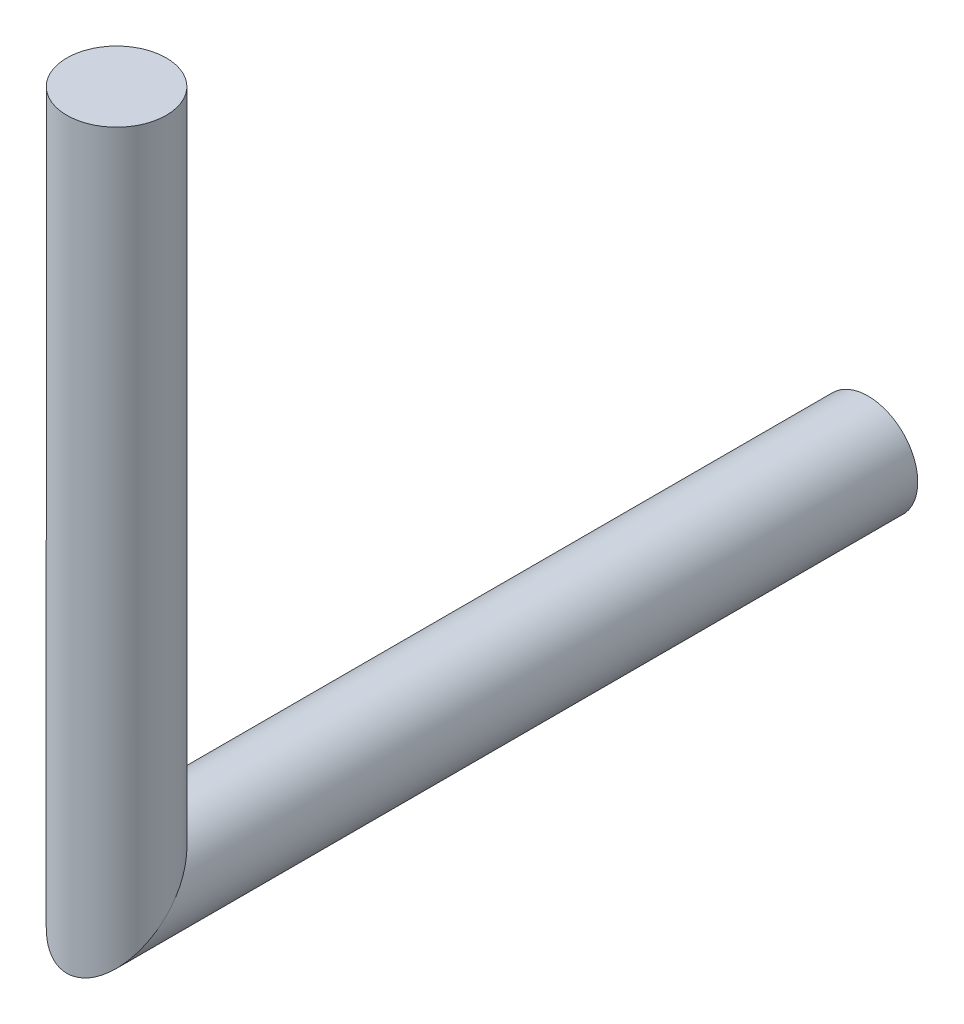
ISO-10303-21;
HEADER;
FILE_DESCRIPTION(('STEP AP214'),'2;1');
FILE_NAME('part.step','',(''),(''),'','','');
FILE_SCHEMA(('AUTOMOTIVE_DESIGN { 1 0 10303 214 1 1 1 1 }'));
ENDSEC;
DATA;
#1=APPLICATION_CONTEXT('core data for automotive mechanical design processes');
#2=APPLICATION_PROTOCOL_DEFINITION('international standard','automotive_design',2000,#1);
#3=PRODUCT_CONTEXT('',#1,'mechanical');
#4=PRODUCT('Part','Part','',(#3));
#5=PRODUCT_RELATED_PRODUCT_CATEGORY('part','',(#4));
#6=PRODUCT_DEFINITION_FORMATION('','',#4);
#7=PRODUCT_DEFINITION_CONTEXT('part definition',#1,'design');
#8=PRODUCT_DEFINITION('design','',#6,#7);
#9=PRODUCT_DEFINITION_SHAPE('','',#8);
#10=(LENGTH_UNIT() NAMED_UNIT(*) SI_UNIT(.MILLI.,.METRE.));
#11=(NAMED_UNIT(*) PLANE_ANGLE_UNIT() SI_UNIT($,.RADIAN.));
#12=(NAMED_UNIT(*) SI_UNIT($,.STERADIAN.) SOLID_ANGLE_UNIT());
#13=UNCERTAINTY_MEASURE_WITH_UNIT(LENGTH_MEASURE(1.E-05),#10,'distance_accuracy_value','');
#14=(GEOMETRIC_REPRESENTATION_CONTEXT(3) GLOBAL_UNCERTAINTY_ASSIGNED_CONTEXT((#13)) GLOBAL_UNIT_ASSIGNED_CONTEXT((#10,
#11,#12)) REPRESENTATION_CONTEXT('',''));
#15=CARTESIAN_POINT('',(0.,0.,0.));
#16=DIRECTION('',(0.,0.,1.));
#17=DIRECTION('',(1.,0.,0.));
#18=AXIS2_PLACEMENT_3D('',#15,#16,#17);
#19=CARTESIAN_POINT('',(0.,0.,-75.5470048007885));
#20=DIRECTION('',(0.,0.,1.));
#21=DIRECTION('',(1.,0.,0.));
#22=AXIS2_PLACEMENT_3D('',#19,#20,#21);
#23=PLANE('',#22);
#24=CARTESIAN_POINT('',(0.,0.,-75.5470048007885));
#25=DIRECTION('',(0.,0.,1.));
#26=DIRECTION('',(1.,0.,0.));
#27=AXIS2_PLACEMENT_3D('',#24,#25,#26);
#28=CIRCLE('',#27,5.);
#29=CARTESIAN_POINT('',(5.,0.,-75.5470048007885));
#30=VERTEX_POINT('',#29);
#31=EDGE_CURVE('E52',#30,#30,#28,.T.);
#32=ORIENTED_EDGE('',*,*,#31,.F.);
#33=EDGE_LOOP('',(#32));
#34=FACE_BOUND('',#33,.T.);
#35=ADVANCED_FACE('F49',(#34),#23,.F.);
#36=CARTESIAN_POINT('',(0.,69.7088856293322,0.));
#37=DIRECTION('',(0.,1.,0.));
#38=DIRECTION('',(1.,0.,0.));
#39=AXIS2_PLACEMENT_3D('',#36,#37,#38);
#40=PLANE('',#39);
#41=CARTESIAN_POINT('',(0.,69.7088856293322,0.));
#42=DIRECTION('',(0.,1.,0.));
#43=DIRECTION('',(1.,0.,0.));
#44=AXIS2_PLACEMENT_3D('',#41,#42,#43);
#45=CIRCLE('',#44,5.);
#46=CARTESIAN_POINT('',(5.,69.7088856293322,0.));
#47=VERTEX_POINT('',#46);
#48=EDGE_CURVE('E56',#47,#47,#45,.T.);
#49=ORIENTED_EDGE('',*,*,#48,.T.);
#50=EDGE_LOOP('',(#49));
#51=FACE_BOUND('',#50,.T.);
#52=ADVANCED_FACE('F69',(#51),#40,.T.);
#53=CARTESIAN_POINT('',(0.,0.,11.1));
#54=DIRECTION('',(0.,0.,-1.));
#55=DIRECTION('',(-1.,0.,0.));
#56=AXIS2_PLACEMENT_3D('',#53,#54,#55);
#57=CYLINDRICAL_SURFACE('',#56,5.);
#58=CARTESIAN_POINT('',(0.,0.,0.));
#59=DIRECTION('',(0.,-0.707106781186547,-0.707106781186547));
#60=DIRECTION('',(0.,-0.707106781186548,0.707106781186548));
#61=AXIS2_PLACEMENT_3D('',#58,#59,#60);
#62=ELLIPSE('',#61,7.07106781186548,5.);
#63=CARTESIAN_POINT('',(0.,-5.,5.));
#64=VERTEX_POINT('',#63);
#65=EDGE_CURVE('E11',#64,#64,#62,.T.);
#66=ORIENTED_EDGE('',*,*,#65,.T.);
#67=EDGE_LOOP('',(#66));
#68=FACE_BOUND('',#67,.T.);
#69=ORIENTED_EDGE('',*,*,#31,.T.);
#70=EDGE_LOOP('',(#69));
#71=FACE_BOUND('',#70,.T.);
#72=ADVANCED_FACE('F66',(#68,#71),#57,.T.);
#73=CARTESIAN_POINT('',(0.,69.7088856293322,0.));
#74=DIRECTION('',(0.,-1.,0.));
#75=DIRECTION('',(0.,0.,-1.));
#76=AXIS2_PLACEMENT_3D('',#73,#74,#75);
#77=CYLINDRICAL_SURFACE('',#76,5.);
#78=ORIENTED_EDGE('',*,*,#48,.F.);
#79=EDGE_LOOP('',(#78));
#80=FACE_BOUND('',#79,.T.);
#81=ORIENTED_EDGE('',*,*,#65,.F.);
#82=EDGE_LOOP('',(#81));
#83=FACE_BOUND('',#82,.T.);
#84=ADVANCED_FACE('F73',(#80,#83),#77,.T.);
#85=CLOSED_SHELL('',(#35,#52,#72,#84));
#86=MANIFOLD_SOLID_BREP('B2',#85);
#87=ADVANCED_BREP_SHAPE_REPRESENTATION('',(#18,#86),#14);
#88=SHAPE_DEFINITION_REPRESENTATION(#9,#87);
ENDSEC;
END-ISO-10303-21;
